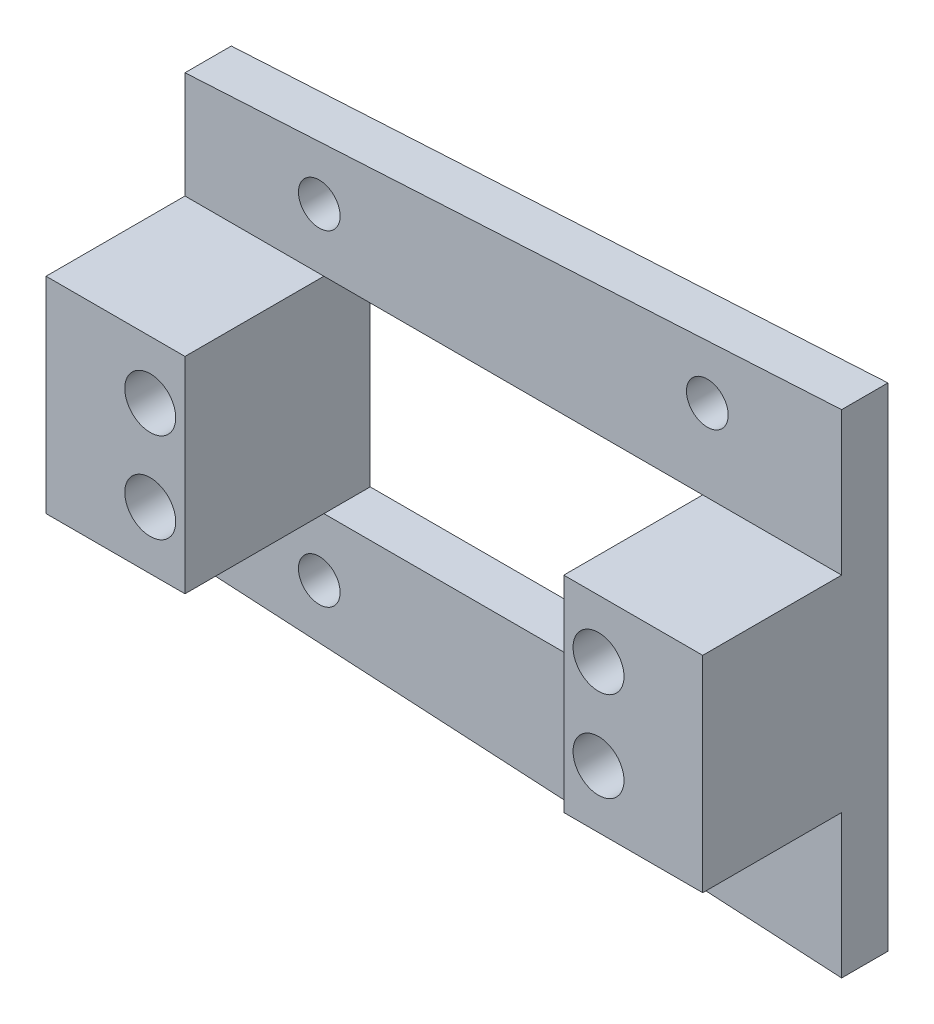
ISO-10303-21;
HEADER;
FILE_DESCRIPTION(('STEP AP214'),'2;1');
FILE_NAME('part.step','',(''),(''),'','','');
FILE_SCHEMA(('AUTOMOTIVE_DESIGN { 1 0 10303 214 1 1 1 1 }'));
ENDSEC;
DATA;
#1=APPLICATION_CONTEXT('core data for automotive mechanical design processes');
#2=APPLICATION_PROTOCOL_DEFINITION('international standard','automotive_design',2000,#1);
#3=PRODUCT_CONTEXT('',#1,'mechanical');
#4=PRODUCT('Part','Part','',(#3));
#5=PRODUCT_RELATED_PRODUCT_CATEGORY('part','',(#4));
#6=PRODUCT_DEFINITION_FORMATION('','',#4);
#7=PRODUCT_DEFINITION_CONTEXT('part definition',#1,'design');
#8=PRODUCT_DEFINITION('design','',#6,#7);
#9=PRODUCT_DEFINITION_SHAPE('','',#8);
#10=(LENGTH_UNIT() NAMED_UNIT(*) SI_UNIT(.MILLI.,.METRE.));
#11=(NAMED_UNIT(*) PLANE_ANGLE_UNIT() SI_UNIT($,.RADIAN.));
#12=(NAMED_UNIT(*) SI_UNIT($,.STERADIAN.) SOLID_ANGLE_UNIT());
#13=UNCERTAINTY_MEASURE_WITH_UNIT(LENGTH_MEASURE(1.E-05),#10,'distance_accuracy_value','');
#14=(GEOMETRIC_REPRESENTATION_CONTEXT(3) GLOBAL_UNCERTAINTY_ASSIGNED_CONTEXT((#13)) GLOBAL_UNIT_ASSIGNED_CONTEXT((#10,
#11,#12)) REPRESENTATION_CONTEXT('',''));
#15=CARTESIAN_POINT('',(0.,0.,0.));
#16=DIRECTION('',(0.,0.,1.));
#17=DIRECTION('',(1.,0.,0.));
#18=AXIS2_PLACEMENT_3D('',#15,#16,#17);
#19=CARTESIAN_POINT('',(0.,-11.1,20.));
#20=DIRECTION('',(0.,1.,0.));
#21=DIRECTION('',(-1.,0.,0.));
#22=AXIS2_PLACEMENT_3D('',#19,#20,#21);
#23=PLANE('',#22);
#24=DIRECTION('',(0.,0.,-1.));
#25=VECTOR('',#24,1.);
#26=CARTESIAN_POINT('',(-20.45,-11.1,20.));
#27=LINE('',#26,#25);
#28=CARTESIAN_POINT('',(-20.45,-11.1,5.));
#29=VERTEX_POINT('',#28);
#30=CARTESIAN_POINT('',(-20.45,-11.1,0.));
#31=VERTEX_POINT('',#30);
#32=EDGE_CURVE('E159',#29,#31,#27,.T.);
#33=ORIENTED_EDGE('',*,*,#32,.F.);
#34=DIRECTION('',(-1.,0.,0.));
#35=VECTOR('',#34,1.);
#36=CARTESIAN_POINT('',(-35.45,-11.1,5.));
#37=LINE('',#36,#35);
#38=CARTESIAN_POINT('',(20.45,-11.1,5.));
#39=VERTEX_POINT('',#38);
#40=EDGE_CURVE('E103',#39,#29,#37,.T.);
#41=ORIENTED_EDGE('',*,*,#40,.F.);
#42=DIRECTION('',(0.,0.,-1.));
#43=VECTOR('',#42,1.);
#44=CARTESIAN_POINT('',(20.45,-11.1,20.));
#45=LINE('',#44,#43);
#46=CARTESIAN_POINT('',(20.45,-11.1,0.));
#47=VERTEX_POINT('',#46);
#48=EDGE_CURVE('E96',#39,#47,#45,.T.);
#49=ORIENTED_EDGE('',*,*,#48,.T.);
#50=DIRECTION('',(1.,0.,0.));
#51=VECTOR('',#50,1.);
#52=CARTESIAN_POINT('',(0.,-11.1,0.));
#53=LINE('',#52,#51);
#54=EDGE_CURVE('E99',#31,#47,#53,.T.);
#55=ORIENTED_EDGE('',*,*,#54,.F.);
#56=EDGE_LOOP('',(#33,#41,#49,#55));
#57=FACE_BOUND('',#56,.T.);
#58=ADVANCED_FACE('F43',(#57),#23,.T.);
#59=CARTESIAN_POINT('',(-1.36497369784606,-24.5240274379677,20.));
#60=DIRECTION('',(0.055572614926474,0.998454648178992,0.));
#61=DIRECTION('',(-0.998454648178992,0.055572614926474,0.));
#62=AXIS2_PLACEMENT_3D('',#59,#60,#61);
#63=PLANE('',#62);
#64=DIRECTION('',(0.998454648178992,-0.055572614926474,0.));
#65=VECTOR('',#64,1.);
#66=CARTESIAN_POINT('',(-1.36497369784606,-24.5240274379677,5.));
#67=LINE('',#66,#65);
#68=CARTESIAN_POINT('',(-35.45,-22.6269016697588,5.));
#69=VERTEX_POINT('',#68);
#70=CARTESIAN_POINT('',(35.45,-26.5730983302412,5.));
#71=VERTEX_POINT('',#70);
#72=EDGE_CURVE('E181',#69,#71,#67,.T.);
#73=ORIENTED_EDGE('',*,*,#72,.F.);
#74=DIRECTION('',(0.,0.,-1.));
#75=VECTOR('',#74,1.);
#76=CARTESIAN_POINT('',(-35.45,-22.6269016697588,20.));
#77=LINE('',#76,#75);
#78=CARTESIAN_POINT('',(-35.45,-22.6269016697588,0.));
#79=VERTEX_POINT('',#78);
#80=EDGE_CURVE('E106',#69,#79,#77,.T.);
#81=ORIENTED_EDGE('',*,*,#80,.T.);
#82=DIRECTION('',(0.998454648178992,-0.055572614926474,0.));
#83=VECTOR('',#82,1.);
#84=CARTESIAN_POINT('',(-1.36497369784606,-24.5240274379677,0.));
#85=LINE('',#84,#83);
#86=CARTESIAN_POINT('',(35.45,-26.5730983302412,0.));
#87=VERTEX_POINT('',#86);
#88=EDGE_CURVE('E250',#79,#87,#85,.T.);
#89=ORIENTED_EDGE('',*,*,#88,.T.);
#90=DIRECTION('',(0.,0.,-1.));
#91=VECTOR('',#90,1.);
#92=CARTESIAN_POINT('',(35.45,-26.5730983302412,20.));
#93=LINE('',#92,#91);
#94=EDGE_CURVE('E169',#71,#87,#93,.T.);
#95=ORIENTED_EDGE('',*,*,#94,.F.);
#96=EDGE_LOOP('',(#73,#81,#89,#95));
#97=FACE_BOUND('',#96,.T.);
#98=ADVANCED_FACE('F267',(#97),#63,.F.);
#99=CARTESIAN_POINT('',(20.95,-19.9320964749536,20.));
#100=DIRECTION('',(0.,0.,-1.));
#101=DIRECTION('',(-1.,0.,0.));
#102=AXIS2_PLACEMENT_3D('',#99,#100,#101);
#103=CYLINDRICAL_SURFACE('',#102,2.25);
#104=CARTESIAN_POINT('',(20.95,-19.9320964749536,0.));
#105=DIRECTION('',(0.,0.,1.));
#106=DIRECTION('',(1.,0.,0.));
#107=AXIS2_PLACEMENT_3D('',#104,#105,#106);
#108=CIRCLE('',#107,2.25);
#109=CARTESIAN_POINT('',(23.2,-19.9320964749536,0.));
#110=VERTEX_POINT('',#109);
#111=EDGE_CURVE('E146',#110,#110,#108,.F.);
#112=ORIENTED_EDGE('',*,*,#111,.T.);
#113=EDGE_LOOP('',(#112));
#114=FACE_BOUND('',#113,.T.);
#115=CARTESIAN_POINT('',(20.95,-19.9320964749536,5.));
#116=DIRECTION('',(0.,0.,1.));
#117=DIRECTION('',(1.,0.,0.));
#118=AXIS2_PLACEMENT_3D('',#115,#116,#117);
#119=CIRCLE('',#118,2.25);
#120=CARTESIAN_POINT('',(23.2,-19.9320964749536,5.));
#121=VERTEX_POINT('',#120);
#122=EDGE_CURVE('E176',#121,#121,#119,.F.);
#123=ORIENTED_EDGE('',*,*,#122,.F.);
#124=EDGE_LOOP('',(#123));
#125=FACE_BOUND('',#124,.T.);
#126=ADVANCED_FACE('F324',(#114,#125),#103,.F.);
#127=CARTESIAN_POINT('',(-20.95,-17.6,20.));
#128=DIRECTION('',(0.,0.,-1.));
#129=DIRECTION('',(-1.,0.,0.));
#130=AXIS2_PLACEMENT_3D('',#127,#128,#129);
#131=CYLINDRICAL_SURFACE('',#130,2.25);
#132=CARTESIAN_POINT('',(-20.95,-17.6,0.));
#133=DIRECTION('',(0.,0.,1.));
#134=DIRECTION('',(1.,0.,0.));
#135=AXIS2_PLACEMENT_3D('',#132,#133,#134);
#136=CIRCLE('',#135,2.25);
#137=CARTESIAN_POINT('',(-18.7,-17.6,0.));
#138=VERTEX_POINT('',#137);
#139=EDGE_CURVE('E149',#138,#138,#136,.F.);
#140=ORIENTED_EDGE('',*,*,#139,.T.);
#141=EDGE_LOOP('',(#140));
#142=FACE_BOUND('',#141,.T.);
#143=CARTESIAN_POINT('',(-20.95,-17.6,5.));
#144=DIRECTION('',(0.,0.,1.));
#145=DIRECTION('',(1.,0.,0.));
#146=AXIS2_PLACEMENT_3D('',#143,#144,#145);
#147=CIRCLE('',#146,2.25);
#148=CARTESIAN_POINT('',(-18.7,-17.6,5.));
#149=VERTEX_POINT('',#148);
#150=EDGE_CURVE('E174',#149,#149,#147,.F.);
#151=ORIENTED_EDGE('',*,*,#150,.F.);
#152=EDGE_LOOP('',(#151));
#153=FACE_BOUND('',#152,.T.);
#154=ADVANCED_FACE('F359',(#142,#153),#131,.F.);
#155=CARTESIAN_POINT('',(0.,0.,20.));
#156=DIRECTION('',(0.,0.,1.));
#157=DIRECTION('',(1.,0.,0.));
#158=AXIS2_PLACEMENT_3D('',#155,#156,#157);
#159=PLANE('',#158);
#160=DIRECTION('',(1.,0.,0.));
#161=VECTOR('',#160,1.);
#162=CARTESIAN_POINT('',(-35.45,11.1,20.));
#163=LINE('',#162,#161);
#164=CARTESIAN_POINT('',(-35.45,11.1,20.));
#165=VERTEX_POINT('',#164);
#166=CARTESIAN_POINT('',(-20.45,11.1,20.));
#167=VERTEX_POINT('',#166);
#168=EDGE_CURVE('E196',#165,#167,#163,.T.);
#169=ORIENTED_EDGE('',*,*,#168,.F.);
#170=DIRECTION('',(0.,-1.,0.));
#171=VECTOR('',#170,1.);
#172=CARTESIAN_POINT('',(-35.45,0.,20.));
#173=LINE('',#172,#171);
#174=CARTESIAN_POINT('',(-35.45,-11.1,20.));
#175=VERTEX_POINT('',#174);
#176=EDGE_CURVE('E151',#165,#175,#173,.T.);
#177=ORIENTED_EDGE('',*,*,#176,.T.);
#178=DIRECTION('',(-1.,0.,0.));
#179=VECTOR('',#178,1.);
#180=CARTESIAN_POINT('',(0.,-11.1,20.));
#181=LINE('',#180,#179);
#182=CARTESIAN_POINT('',(-20.45,-11.1,20.));
#183=VERTEX_POINT('',#182);
#184=EDGE_CURVE('E163',#183,#175,#181,.T.);
#185=ORIENTED_EDGE('',*,*,#184,.F.);
#186=DIRECTION('',(0.,-1.,0.));
#187=VECTOR('',#186,1.);
#188=CARTESIAN_POINT('',(-20.45,0.,20.));
#189=LINE('',#188,#187);
#190=EDGE_CURVE('E231',#167,#183,#189,.T.);
#191=ORIENTED_EDGE('',*,*,#190,.F.);
#192=EDGE_LOOP('',(#169,#177,#185,#191));
#193=FACE_BOUND('',#192,.T.);
#194=CARTESIAN_POINT('',(-24.2,4.86,20.));
#195=DIRECTION('',(0.,0.,1.));
#196=DIRECTION('',(1.,0.,0.));
#197=AXIS2_PLACEMENT_3D('',#194,#195,#196);
#198=CIRCLE('',#197,2.75);
#199=CARTESIAN_POINT('',(-21.45,4.86,20.));
#200=VERTEX_POINT('',#199);
#201=EDGE_CURVE('E240',#200,#200,#198,.T.);
#202=ORIENTED_EDGE('',*,*,#201,.F.);
#203=EDGE_LOOP('',(#202));
#204=FACE_BOUND('',#203,.T.);
#205=CARTESIAN_POINT('',(-24.2,-4.86,20.));
#206=DIRECTION('',(0.,0.,1.));
#207=DIRECTION('',(1.,0.,0.));
#208=AXIS2_PLACEMENT_3D('',#205,#206,#207);
#209=CIRCLE('',#208,2.75);
#210=CARTESIAN_POINT('',(-21.45,-4.86,20.));
#211=VERTEX_POINT('',#210);
#212=EDGE_CURVE('E237',#211,#211,#209,.T.);
#213=ORIENTED_EDGE('',*,*,#212,.F.);
#214=EDGE_LOOP('',(#213));
#215=FACE_BOUND('',#214,.T.);
#216=ADVANCED_FACE('F314',(#193,#204,#215),#159,.T.);
#217=CARTESIAN_POINT('',(-20.45,0.,20.));
#218=DIRECTION('',(1.,0.,0.));
#219=DIRECTION('',(0.,0.,-1.));
#220=AXIS2_PLACEMENT_3D('',#217,#218,#219);
#221=PLANE('',#220);
#222=DIRECTION('',(0.,-1.,0.));
#223=VECTOR('',#222,1.);
#224=CARTESIAN_POINT('',(-20.45,0.,0.));
#225=LINE('',#224,#223);
#226=CARTESIAN_POINT('',(-20.45,11.1,0.));
#227=VERTEX_POINT('',#226);
#228=EDGE_CURVE('E119',#227,#31,#225,.T.);
#229=ORIENTED_EDGE('',*,*,#228,.F.);
#230=DIRECTION('',(0.,0.,-1.));
#231=VECTOR('',#230,1.);
#232=CARTESIAN_POINT('',(-20.45,11.1,20.));
#233=LINE('',#232,#231);
#234=CARTESIAN_POINT('',(-20.45,11.1,5.));
#235=VERTEX_POINT('',#234);
#236=EDGE_CURVE('E155',#235,#227,#233,.T.);
#237=ORIENTED_EDGE('',*,*,#236,.F.);
#238=EDGE_CURVE('E156',#167,#235,#233,.T.);
#239=ORIENTED_EDGE('',*,*,#238,.F.);
#240=ORIENTED_EDGE('',*,*,#190,.T.);
#241=EDGE_CURVE('E160',#183,#29,#27,.T.);
#242=ORIENTED_EDGE('',*,*,#241,.T.);
#243=ORIENTED_EDGE('',*,*,#32,.T.);
#244=EDGE_LOOP('',(#229,#237,#239,#240,#242,#243));
#245=FACE_BOUND('',#244,.T.);
#246=ADVANCED_FACE('F326',(#245),#221,.T.);
#247=CARTESIAN_POINT('',(0.,11.1,20.));
#248=DIRECTION('',(0.,-1.,0.));
#249=DIRECTION('',(1.,0.,0.));
#250=AXIS2_PLACEMENT_3D('',#247,#248,#249);
#251=PLANE('',#250);
#252=DIRECTION('',(1.,0.,0.));
#253=VECTOR('',#252,1.);
#254=CARTESIAN_POINT('',(-35.45,11.1,5.));
#255=LINE('',#254,#253);
#256=CARTESIAN_POINT('',(20.45,11.1,5.));
#257=VERTEX_POINT('',#256);
#258=EDGE_CURVE('E428',#235,#257,#255,.T.);
#259=ORIENTED_EDGE('',*,*,#258,.F.);
#260=ORIENTED_EDGE('',*,*,#236,.T.);
#261=DIRECTION('',(-1.,0.,0.));
#262=VECTOR('',#261,1.);
#263=CARTESIAN_POINT('',(0.,11.1,0.));
#264=LINE('',#263,#262);
#265=CARTESIAN_POINT('',(20.45,11.1,0.));
#266=VERTEX_POINT('',#265);
#267=EDGE_CURVE('E114',#266,#227,#264,.T.);
#268=ORIENTED_EDGE('',*,*,#267,.F.);
#269=DIRECTION('',(0.,0.,-1.));
#270=VECTOR('',#269,1.);
#271=CARTESIAN_POINT('',(20.45,11.1,20.));
#272=LINE('',#271,#270);
#273=EDGE_CURVE('E89',#257,#266,#272,.T.);
#274=ORIENTED_EDGE('',*,*,#273,.F.);
#275=EDGE_LOOP('',(#259,#260,#268,#274));
#276=FACE_BOUND('',#275,.T.);
#277=ADVANCED_FACE('F329',(#276),#251,.T.);
#278=CARTESIAN_POINT('',(-35.45,0.,20.));
#279=DIRECTION('',(1.,0.,0.));
#280=DIRECTION('',(0.,0.,-1.));
#281=AXIS2_PLACEMENT_3D('',#278,#279,#280);
#282=PLANE('',#281);
#283=ORIENTED_EDGE('',*,*,#176,.F.);
#284=DIRECTION('',(0.,0.,1.));
#285=VECTOR('',#284,1.);
#286=CARTESIAN_POINT('',(-35.45,11.1,5.));
#287=LINE('',#286,#285);
#288=CARTESIAN_POINT('',(-35.45,11.1,5.));
#289=VERTEX_POINT('',#288);
#290=EDGE_CURVE('E184',#289,#165,#287,.T.);
#291=ORIENTED_EDGE('',*,*,#290,.F.);
#292=DIRECTION('',(0.,-1.,0.));
#293=VECTOR('',#292,1.);
#294=CARTESIAN_POINT('',(-35.45,11.1,5.));
#295=LINE('',#294,#293);
#296=CARTESIAN_POINT('',(-35.45,22.6269016697588,5.));
#297=VERTEX_POINT('',#296);
#298=EDGE_CURVE('E296',#297,#289,#295,.T.);
#299=ORIENTED_EDGE('',*,*,#298,.F.);
#300=DIRECTION('',(0.,0.,-1.));
#301=VECTOR('',#300,1.);
#302=CARTESIAN_POINT('',(-35.45,22.6269016697588,20.));
#303=LINE('',#302,#301);
#304=CARTESIAN_POINT('',(-35.45,22.6269016697588,0.));
#305=VERTEX_POINT('',#304);
#306=EDGE_CURVE('E164',#297,#305,#303,.T.);
#307=ORIENTED_EDGE('',*,*,#306,.T.);
#308=DIRECTION('',(0.,-1.,0.));
#309=VECTOR('',#308,1.);
#310=CARTESIAN_POINT('',(-35.45,0.,0.));
#311=LINE('',#310,#309);
#312=EDGE_CURVE('E226',#305,#79,#311,.T.);
#313=ORIENTED_EDGE('',*,*,#312,.T.);
#314=ORIENTED_EDGE('',*,*,#80,.F.);
#315=DIRECTION('',(0.,-1.,0.));
#316=VECTOR('',#315,1.);
#317=CARTESIAN_POINT('',(-35.45,-11.1,5.));
#318=LINE('',#317,#316);
#319=CARTESIAN_POINT('',(-35.45,-11.1,5.));
#320=VERTEX_POINT('',#319);
#321=EDGE_CURVE('E209',#320,#69,#318,.T.);
#322=ORIENTED_EDGE('',*,*,#321,.F.);
#323=DIRECTION('',(0.,0.,1.));
#324=VECTOR('',#323,1.);
#325=CARTESIAN_POINT('',(-35.45,-11.1,5.));
#326=LINE('',#325,#324);
#327=EDGE_CURVE('E203',#320,#175,#326,.T.);
#328=ORIENTED_EDGE('',*,*,#327,.T.);
#329=EDGE_LOOP('',(#283,#291,#299,#307,#313,#314,#322,#328));
#330=FACE_BOUND('',#329,.T.);
#331=ADVANCED_FACE('F45',(#330),#282,.F.);
#332=CARTESIAN_POINT('',(35.45,0.,20.));
#333=DIRECTION('',(1.,0.,0.));
#334=DIRECTION('',(0.,1.,0.));
#335=AXIS2_PLACEMENT_3D('',#332,#333,#334);
#336=PLANE('',#335);
#337=DIRECTION('',(0.,0.,1.));
#338=VECTOR('',#337,1.);
#339=CARTESIAN_POINT('',(35.45,11.1,5.));
#340=LINE('',#339,#338);
#341=CARTESIAN_POINT('',(35.45,11.1,5.));
#342=VERTEX_POINT('',#341);
#343=CARTESIAN_POINT('',(35.45,11.1,20.));
#344=VERTEX_POINT('',#343);
#345=EDGE_CURVE('E177',#342,#344,#340,.T.);
#346=ORIENTED_EDGE('',*,*,#345,.T.);
#347=DIRECTION('',(0.,-1.,0.));
#348=VECTOR('',#347,1.);
#349=CARTESIAN_POINT('',(35.45,0.,20.));
#350=LINE('',#349,#348);
#351=CARTESIAN_POINT('',(35.45,-11.1,20.));
#352=VERTEX_POINT('',#351);
#353=EDGE_CURVE('E229',#344,#352,#350,.T.);
#354=ORIENTED_EDGE('',*,*,#353,.T.);
#355=DIRECTION('',(0.,0.,1.));
#356=VECTOR('',#355,1.);
#357=CARTESIAN_POINT('',(35.45,-11.1,5.));
#358=LINE('',#357,#356);
#359=CARTESIAN_POINT('',(35.45,-11.1,5.));
#360=VERTEX_POINT('',#359);
#361=EDGE_CURVE('E199',#360,#352,#358,.T.);
#362=ORIENTED_EDGE('',*,*,#361,.F.);
#363=DIRECTION('',(0.,1.,0.));
#364=VECTOR('',#363,1.);
#365=CARTESIAN_POINT('',(35.45,-11.1,5.));
#366=LINE('',#365,#364);
#367=EDGE_CURVE('E213',#71,#360,#366,.T.);
#368=ORIENTED_EDGE('',*,*,#367,.F.);
#369=ORIENTED_EDGE('',*,*,#94,.T.);
#370=DIRECTION('',(0.,-1.,0.));
#371=VECTOR('',#370,1.);
#372=CARTESIAN_POINT('',(35.45,0.,0.));
#373=LINE('',#372,#371);
#374=CARTESIAN_POINT('',(35.45,26.5730983302412,0.));
#375=VERTEX_POINT('',#374);
#376=EDGE_CURVE('E124',#375,#87,#373,.T.);
#377=ORIENTED_EDGE('',*,*,#376,.F.);
#378=DIRECTION('',(0.,0.,-1.));
#379=VECTOR('',#378,1.);
#380=CARTESIAN_POINT('',(35.45,26.5730983302412,20.));
#381=LINE('',#380,#379);
#382=CARTESIAN_POINT('',(35.45,26.5730983302412,5.));
#383=VERTEX_POINT('',#382);
#384=EDGE_CURVE('E166',#383,#375,#381,.T.);
#385=ORIENTED_EDGE('',*,*,#384,.F.);
#386=DIRECTION('',(0.,1.,0.));
#387=VECTOR('',#386,1.);
#388=CARTESIAN_POINT('',(35.45,11.1,5.));
#389=LINE('',#388,#387);
#390=EDGE_CURVE('E193',#342,#383,#389,.T.);
#391=ORIENTED_EDGE('',*,*,#390,.F.);
#392=EDGE_LOOP('',(#346,#354,#362,#368,#369,#377,#385,#391));
#393=FACE_BOUND('',#392,.T.);
#394=ADVANCED_FACE('F259',(#393),#336,.T.);
#395=CARTESIAN_POINT('',(-20.95,17.6,20.));
#396=DIRECTION('',(0.,0.,-1.));
#397=DIRECTION('',(-1.,0.,0.));
#398=AXIS2_PLACEMENT_3D('',#395,#396,#397);
#399=CYLINDRICAL_SURFACE('',#398,2.25);
#400=CARTESIAN_POINT('',(-20.95,17.6,5.));
#401=DIRECTION('',(0.,0.,-1.));
#402=DIRECTION('',(-1.,0.,0.));
#403=AXIS2_PLACEMENT_3D('',#400,#401,#402);
#404=CIRCLE('',#403,2.25);
#405=CARTESIAN_POINT('',(-23.2,17.6,5.));
#406=VERTEX_POINT('',#405);
#407=EDGE_CURVE('E223',#406,#406,#404,.T.);
#408=ORIENTED_EDGE('',*,*,#407,.F.);
#409=EDGE_LOOP('',(#408));
#410=FACE_BOUND('',#409,.T.);
#411=CARTESIAN_POINT('',(-20.95,17.6,0.));
#412=DIRECTION('',(0.,0.,1.));
#413=DIRECTION('',(1.,0.,0.));
#414=AXIS2_PLACEMENT_3D('',#411,#412,#413);
#415=CIRCLE('',#414,2.25);
#416=CARTESIAN_POINT('',(-18.7,17.6,0.));
#417=VERTEX_POINT('',#416);
#418=EDGE_CURVE('E143',#417,#417,#415,.T.);
#419=ORIENTED_EDGE('',*,*,#418,.F.);
#420=EDGE_LOOP('',(#419));
#421=FACE_BOUND('',#420,.T.);
#422=ADVANCED_FACE('F352',(#410,#421),#399,.F.);
#423=CARTESIAN_POINT('',(20.95,19.9320964749536,20.));
#424=DIRECTION('',(0.,0.,-1.));
#425=DIRECTION('',(-1.,0.,0.));
#426=AXIS2_PLACEMENT_3D('',#423,#424,#425);
#427=CYLINDRICAL_SURFACE('',#426,2.25);
#428=CARTESIAN_POINT('',(20.95,19.9320964749536,5.));
#429=DIRECTION('',(0.,0.,-1.));
#430=DIRECTION('',(-1.,0.,0.));
#431=AXIS2_PLACEMENT_3D('',#428,#429,#430);
#432=CIRCLE('',#431,2.25);
#433=CARTESIAN_POINT('',(18.7,19.9320964749536,5.));
#434=VERTEX_POINT('',#433);
#435=EDGE_CURVE('E220',#434,#434,#432,.T.);
#436=ORIENTED_EDGE('',*,*,#435,.F.);
#437=EDGE_LOOP('',(#436));
#438=FACE_BOUND('',#437,.T.);
#439=CARTESIAN_POINT('',(20.95,19.9320964749536,0.));
#440=DIRECTION('',(0.,0.,1.));
#441=DIRECTION('',(1.,0.,0.));
#442=AXIS2_PLACEMENT_3D('',#439,#440,#441);
#443=CIRCLE('',#442,2.25);
#444=CARTESIAN_POINT('',(23.2,19.9320964749536,0.));
#445=VERTEX_POINT('',#444);
#446=EDGE_CURVE('E140',#445,#445,#443,.T.);
#447=ORIENTED_EDGE('',*,*,#446,.F.);
#448=EDGE_LOOP('',(#447));
#449=FACE_BOUND('',#448,.T.);
#450=ADVANCED_FACE('F348',(#438,#449),#427,.F.);
#451=CARTESIAN_POINT('',(24.2,-4.86,20.));
#452=DIRECTION('',(0.,0.,-1.));
#453=DIRECTION('',(-1.,0.,0.));
#454=AXIS2_PLACEMENT_3D('',#451,#452,#453);
#455=CYLINDRICAL_SURFACE('',#454,2.75);
#456=CARTESIAN_POINT('',(24.2,-4.86,20.));
#457=DIRECTION('',(0.,0.,1.));
#458=DIRECTION('',(1.,0.,0.));
#459=AXIS2_PLACEMENT_3D('',#456,#457,#458);
#460=CIRCLE('',#459,2.75);
#461=CARTESIAN_POINT('',(26.95,-4.86,20.));
#462=VERTEX_POINT('',#461);
#463=EDGE_CURVE('E167',#462,#462,#460,.F.);
#464=ORIENTED_EDGE('',*,*,#463,.F.);
#465=EDGE_LOOP('',(#464));
#466=FACE_BOUND('',#465,.T.);
#467=CARTESIAN_POINT('',(24.2,-4.86,0.));
#468=DIRECTION('',(0.,0.,1.));
#469=DIRECTION('',(1.,0.,0.));
#470=AXIS2_PLACEMENT_3D('',#467,#468,#469);
#471=CIRCLE('',#470,2.75);
#472=CARTESIAN_POINT('',(26.95,-4.86,0.));
#473=VERTEX_POINT('',#472);
#474=EDGE_CURVE('E137',#473,#473,#471,.F.);
#475=ORIENTED_EDGE('',*,*,#474,.T.);
#476=EDGE_LOOP('',(#475));
#477=FACE_BOUND('',#476,.T.);
#478=ADVANCED_FACE('F344',(#466,#477),#455,.F.);
#479=CARTESIAN_POINT('',(24.2,4.86000000000001,20.));
#480=DIRECTION('',(0.,0.,-1.));
#481=DIRECTION('',(-1.,0.,0.));
#482=AXIS2_PLACEMENT_3D('',#479,#480,#481);
#483=CYLINDRICAL_SURFACE('',#482,2.75);
#484=CARTESIAN_POINT('',(24.2,4.86000000000001,20.));
#485=DIRECTION('',(0.,0.,1.));
#486=DIRECTION('',(1.,0.,0.));
#487=AXIS2_PLACEMENT_3D('',#484,#485,#486);
#488=CIRCLE('',#487,2.75);
#489=CARTESIAN_POINT('',(26.95,4.86000000000001,20.));
#490=VERTEX_POINT('',#489);
#491=EDGE_CURVE('E243',#490,#490,#488,.F.);
#492=ORIENTED_EDGE('',*,*,#491,.F.);
#493=EDGE_LOOP('',(#492));
#494=FACE_BOUND('',#493,.T.);
#495=CARTESIAN_POINT('',(24.2,4.86000000000001,0.));
#496=DIRECTION('',(0.,0.,1.));
#497=DIRECTION('',(1.,0.,0.));
#498=AXIS2_PLACEMENT_3D('',#495,#496,#497);
#499=CIRCLE('',#498,2.75);
#500=CARTESIAN_POINT('',(26.95,4.86000000000001,0.));
#501=VERTEX_POINT('',#500);
#502=EDGE_CURVE('E134',#501,#501,#499,.F.);
#503=ORIENTED_EDGE('',*,*,#502,.T.);
#504=EDGE_LOOP('',(#503));
#505=FACE_BOUND('',#504,.T.);
#506=ADVANCED_FACE('F340',(#494,#505),#483,.F.);
#507=CARTESIAN_POINT('',(-24.2,4.86,20.));
#508=DIRECTION('',(0.,0.,-1.));
#509=DIRECTION('',(-1.,0.,0.));
#510=AXIS2_PLACEMENT_3D('',#507,#508,#509);
#511=CYLINDRICAL_SURFACE('',#510,2.75);
#512=ORIENTED_EDGE('',*,*,#201,.T.);
#513=EDGE_LOOP('',(#512));
#514=FACE_BOUND('',#513,.T.);
#515=CARTESIAN_POINT('',(-24.2,4.86,0.));
#516=DIRECTION('',(0.,0.,1.));
#517=DIRECTION('',(1.,0.,0.));
#518=AXIS2_PLACEMENT_3D('',#515,#516,#517);
#519=CIRCLE('',#518,2.75);
#520=CARTESIAN_POINT('',(-21.45,4.86,0.));
#521=VERTEX_POINT('',#520);
#522=EDGE_CURVE('E131',#521,#521,#519,.T.);
#523=ORIENTED_EDGE('',*,*,#522,.F.);
#524=EDGE_LOOP('',(#523));
#525=FACE_BOUND('',#524,.T.);
#526=ADVANCED_FACE('F336',(#514,#525),#511,.F.);
#527=CARTESIAN_POINT('',(-24.2,-4.86,20.));
#528=DIRECTION('',(0.,0.,-1.));
#529=DIRECTION('',(-1.,0.,0.));
#530=AXIS2_PLACEMENT_3D('',#527,#528,#529);
#531=CYLINDRICAL_SURFACE('',#530,2.75);
#532=ORIENTED_EDGE('',*,*,#212,.T.);
#533=EDGE_LOOP('',(#532));
#534=FACE_BOUND('',#533,.T.);
#535=CARTESIAN_POINT('',(-24.2,-4.86,0.));
#536=DIRECTION('',(0.,0.,1.));
#537=DIRECTION('',(1.,0.,0.));
#538=AXIS2_PLACEMENT_3D('',#535,#536,#537);
#539=CIRCLE('',#538,2.75);
#540=CARTESIAN_POINT('',(-21.45,-4.86,0.));
#541=VERTEX_POINT('',#540);
#542=EDGE_CURVE('E113',#541,#541,#539,.T.);
#543=ORIENTED_EDGE('',*,*,#542,.F.);
#544=EDGE_LOOP('',(#543));
#545=FACE_BOUND('',#544,.T.);
#546=ADVANCED_FACE('F315',(#534,#545),#531,.F.);
#547=CARTESIAN_POINT('',(20.45,0.,20.));
#548=DIRECTION('',(1.,0.,0.));
#549=DIRECTION('',(0.,0.,-1.));
#550=AXIS2_PLACEMENT_3D('',#547,#548,#549);
#551=PLANE('',#550);
#552=DIRECTION('',(0.,-1.,0.));
#553=VECTOR('',#552,1.);
#554=CARTESIAN_POINT('',(20.45,0.,0.));
#555=LINE('',#554,#553);
#556=EDGE_CURVE('E108',#266,#47,#555,.T.);
#557=ORIENTED_EDGE('',*,*,#556,.T.);
#558=ORIENTED_EDGE('',*,*,#48,.F.);
#559=CARTESIAN_POINT('',(20.45,-11.1,20.));
#560=VERTEX_POINT('',#559);
#561=EDGE_CURVE('E105',#560,#39,#45,.T.);
#562=ORIENTED_EDGE('',*,*,#561,.F.);
#563=DIRECTION('',(0.,-1.,0.));
#564=VECTOR('',#563,1.);
#565=CARTESIAN_POINT('',(20.45,0.,20.));
#566=LINE('',#565,#564);
#567=CARTESIAN_POINT('',(20.45,11.1,20.));
#568=VERTEX_POINT('',#567);
#569=EDGE_CURVE('E234',#568,#560,#566,.T.);
#570=ORIENTED_EDGE('',*,*,#569,.F.);
#571=EDGE_CURVE('E60',#568,#257,#272,.T.);
#572=ORIENTED_EDGE('',*,*,#571,.T.);
#573=ORIENTED_EDGE('',*,*,#273,.T.);
#574=EDGE_LOOP('',(#557,#558,#562,#570,#572,#573));
#575=FACE_BOUND('',#574,.T.);
#576=ADVANCED_FACE('F109',(#575),#551,.F.);
#577=CARTESIAN_POINT('',(-1.36497369784607,24.5240274379677,20.));
#578=DIRECTION('',(-0.0555726149264744,0.998454648178992,0.));
#579=DIRECTION('',(-0.998454648178992,-0.0555726149264744,0.));
#580=AXIS2_PLACEMENT_3D('',#577,#578,#579);
#581=PLANE('',#580);
#582=DIRECTION('',(-0.998454648178992,-0.0555726149264744,0.));
#583=VECTOR('',#582,1.);
#584=CARTESIAN_POINT('',(-1.36497369784607,24.5240274379677,5.));
#585=LINE('',#584,#583);
#586=EDGE_CURVE('E12',#383,#297,#585,.T.);
#587=ORIENTED_EDGE('',*,*,#586,.F.);
#588=ORIENTED_EDGE('',*,*,#384,.T.);
#589=DIRECTION('',(0.998454648178992,0.0555726149264744,0.));
#590=VECTOR('',#589,1.);
#591=CARTESIAN_POINT('',(-1.36497369784607,24.5240274379677,0.));
#592=LINE('',#591,#590);
#593=EDGE_CURVE('E120',#305,#375,#592,.T.);
#594=ORIENTED_EDGE('',*,*,#593,.F.);
#595=ORIENTED_EDGE('',*,*,#306,.F.);
#596=EDGE_LOOP('',(#587,#588,#594,#595));
#597=FACE_BOUND('',#596,.T.);
#598=ADVANCED_FACE('F304',(#597),#581,.T.);
#599=DIRECTION('',(1.,0.,0.));
#600=VECTOR('',#599,1.);
#601=CARTESIAN_POINT('',(0.,11.1,20.));
#602=LINE('',#601,#600);
#603=EDGE_CURVE('E52',#568,#344,#602,.T.);
#604=ORIENTED_EDGE('',*,*,#603,.F.);
#605=ORIENTED_EDGE('',*,*,#569,.T.);
#606=DIRECTION('',(-1.,0.,0.));
#607=VECTOR('',#606,1.);
#608=CARTESIAN_POINT('',(-35.45,-11.1,20.));
#609=LINE('',#608,#607);
#610=EDGE_CURVE('E206',#352,#560,#609,.T.);
#611=ORIENTED_EDGE('',*,*,#610,.F.);
#612=ORIENTED_EDGE('',*,*,#353,.F.);
#613=EDGE_LOOP('',(#604,#605,#611,#612));
#614=FACE_BOUND('',#613,.T.);
#615=ORIENTED_EDGE('',*,*,#491,.T.);
#616=EDGE_LOOP('',(#615));
#617=FACE_BOUND('',#616,.T.);
#618=ORIENTED_EDGE('',*,*,#463,.T.);
#619=EDGE_LOOP('',(#618));
#620=FACE_BOUND('',#619,.T.);
#621=ADVANCED_FACE('F306',(#614,#617,#620),#159,.T.);
#622=CARTESIAN_POINT('',(0.,0.,0.));
#623=DIRECTION('',(0.,0.,1.));
#624=DIRECTION('',(1.,0.,0.));
#625=AXIS2_PLACEMENT_3D('',#622,#623,#624);
#626=PLANE('',#625);
#627=ORIENTED_EDGE('',*,*,#312,.F.);
#628=ORIENTED_EDGE('',*,*,#593,.T.);
#629=ORIENTED_EDGE('',*,*,#376,.T.);
#630=ORIENTED_EDGE('',*,*,#88,.F.);
#631=EDGE_LOOP('',(#627,#628,#629,#630));
#632=FACE_BOUND('',#631,.T.);
#633=ORIENTED_EDGE('',*,*,#54,.T.);
#634=ORIENTED_EDGE('',*,*,#556,.F.);
#635=ORIENTED_EDGE('',*,*,#267,.T.);
#636=ORIENTED_EDGE('',*,*,#228,.T.);
#637=EDGE_LOOP('',(#633,#634,#635,#636));
#638=FACE_BOUND('',#637,.T.);
#639=ORIENTED_EDGE('',*,*,#542,.T.);
#640=EDGE_LOOP('',(#639));
#641=FACE_BOUND('',#640,.T.);
#642=ORIENTED_EDGE('',*,*,#522,.T.);
#643=EDGE_LOOP('',(#642));
#644=FACE_BOUND('',#643,.T.);
#645=ORIENTED_EDGE('',*,*,#502,.F.);
#646=EDGE_LOOP('',(#645));
#647=FACE_BOUND('',#646,.T.);
#648=ORIENTED_EDGE('',*,*,#474,.F.);
#649=EDGE_LOOP('',(#648));
#650=FACE_BOUND('',#649,.T.);
#651=ORIENTED_EDGE('',*,*,#446,.T.);
#652=EDGE_LOOP('',(#651));
#653=FACE_BOUND('',#652,.T.);
#654=ORIENTED_EDGE('',*,*,#418,.T.);
#655=EDGE_LOOP('',(#654));
#656=FACE_BOUND('',#655,.T.);
#657=ORIENTED_EDGE('',*,*,#111,.F.);
#658=EDGE_LOOP('',(#657));
#659=FACE_BOUND('',#658,.T.);
#660=ORIENTED_EDGE('',*,*,#139,.F.);
#661=EDGE_LOOP('',(#660));
#662=FACE_BOUND('',#661,.T.);
#663=ADVANCED_FACE('F116',(#632,#638,#641,#644,#647,#650,#653,#656,#659,#662),#626,.F.);
#664=CARTESIAN_POINT('',(0.,0.,5.));
#665=DIRECTION('',(0.,0.,1.));
#666=DIRECTION('',(1.,0.,0.));
#667=AXIS2_PLACEMENT_3D('',#664,#665,#666);
#668=PLANE('',#667);
#669=ORIENTED_EDGE('',*,*,#122,.T.);
#670=EDGE_LOOP('',(#669));
#671=FACE_BOUND('',#670,.T.);
#672=ORIENTED_EDGE('',*,*,#150,.T.);
#673=EDGE_LOOP('',(#672));
#674=FACE_BOUND('',#673,.T.);
#675=ORIENTED_EDGE('',*,*,#72,.T.);
#676=ORIENTED_EDGE('',*,*,#367,.T.);
#677=EDGE_CURVE('E210',#360,#39,#37,.T.);
#678=ORIENTED_EDGE('',*,*,#677,.T.);
#679=ORIENTED_EDGE('',*,*,#40,.T.);
#680=EDGE_CURVE('E202',#29,#320,#37,.T.);
#681=ORIENTED_EDGE('',*,*,#680,.T.);
#682=ORIENTED_EDGE('',*,*,#321,.T.);
#683=EDGE_LOOP('',(#675,#676,#678,#679,#681,#682));
#684=FACE_BOUND('',#683,.T.);
#685=ADVANCED_FACE('F364',(#671,#674,#684),#668,.T.);
#686=CARTESIAN_POINT('',(-35.45,-11.1,5.));
#687=DIRECTION('',(0.,1.,0.));
#688=DIRECTION('',(-1.,0.,0.));
#689=AXIS2_PLACEMENT_3D('',#686,#687,#688);
#690=PLANE('',#689);
#691=ORIENTED_EDGE('',*,*,#677,.F.);
#692=ORIENTED_EDGE('',*,*,#361,.T.);
#693=ORIENTED_EDGE('',*,*,#610,.T.);
#694=ORIENTED_EDGE('',*,*,#561,.T.);
#695=EDGE_LOOP('',(#691,#692,#693,#694));
#696=FACE_BOUND('',#695,.T.);
#697=ADVANCED_FACE('F368',(#696),#690,.F.);
#698=ORIENTED_EDGE('',*,*,#241,.F.);
#699=ORIENTED_EDGE('',*,*,#184,.T.);
#700=ORIENTED_EDGE('',*,*,#327,.F.);
#701=ORIENTED_EDGE('',*,*,#680,.F.);
#702=EDGE_LOOP('',(#698,#699,#700,#701));
#703=FACE_BOUND('',#702,.T.);
#704=ADVANCED_FACE('F370',(#703),#690,.F.);
#705=CARTESIAN_POINT('',(-35.45,11.1,5.));
#706=DIRECTION('',(0.,-1.,0.));
#707=DIRECTION('',(0.,0.,-1.));
#708=AXIS2_PLACEMENT_3D('',#705,#706,#707);
#709=PLANE('',#708);
#710=ORIENTED_EDGE('',*,*,#603,.T.);
#711=ORIENTED_EDGE('',*,*,#345,.F.);
#712=EDGE_CURVE('E302',#257,#342,#255,.T.);
#713=ORIENTED_EDGE('',*,*,#712,.F.);
#714=ORIENTED_EDGE('',*,*,#571,.F.);
#715=EDGE_LOOP('',(#710,#711,#713,#714));
#716=FACE_BOUND('',#715,.T.);
#717=ADVANCED_FACE('F373',(#716),#709,.F.);
#718=ORIENTED_EDGE('',*,*,#238,.T.);
#719=EDGE_CURVE('E430',#289,#235,#255,.T.);
#720=ORIENTED_EDGE('',*,*,#719,.F.);
#721=ORIENTED_EDGE('',*,*,#290,.T.);
#722=ORIENTED_EDGE('',*,*,#168,.T.);
#723=EDGE_LOOP('',(#718,#720,#721,#722));
#724=FACE_BOUND('',#723,.T.);
#725=ADVANCED_FACE('F375',(#724),#709,.F.);
#726=CARTESIAN_POINT('',(0.,0.,5.));
#727=DIRECTION('',(0.,0.,-1.));
#728=DIRECTION('',(-1.,0.,0.));
#729=AXIS2_PLACEMENT_3D('',#726,#727,#728);
#730=PLANE('',#729);
#731=ORIENTED_EDGE('',*,*,#407,.T.);
#732=EDGE_LOOP('',(#731));
#733=FACE_BOUND('',#732,.T.);
#734=ORIENTED_EDGE('',*,*,#435,.T.);
#735=EDGE_LOOP('',(#734));
#736=FACE_BOUND('',#735,.T.);
#737=ORIENTED_EDGE('',*,*,#586,.T.);
#738=ORIENTED_EDGE('',*,*,#298,.T.);
#739=ORIENTED_EDGE('',*,*,#719,.T.);
#740=ORIENTED_EDGE('',*,*,#258,.T.);
#741=ORIENTED_EDGE('',*,*,#712,.T.);
#742=ORIENTED_EDGE('',*,*,#390,.T.);
#743=EDGE_LOOP('',(#737,#738,#739,#740,#741,#742));
#744=FACE_BOUND('',#743,.T.);
#745=ADVANCED_FACE('F293',(#733,#736,#744),#730,.F.);
#746=CLOSED_SHELL('',(#58,#98,#126,#154,#216,#246,#277,#331,#394,#422,#450,#478,#506,#526,#546,
#576,#598,#621,#663,#685,#697,#704,#717,#725,#745));
#747=MANIFOLD_SOLID_BREP('B2',#746);
#748=ADVANCED_BREP_SHAPE_REPRESENTATION('',(#18,#747),#14);
#749=SHAPE_DEFINITION_REPRESENTATION(#9,#748);
ENDSEC;
END-ISO-10303-21;
